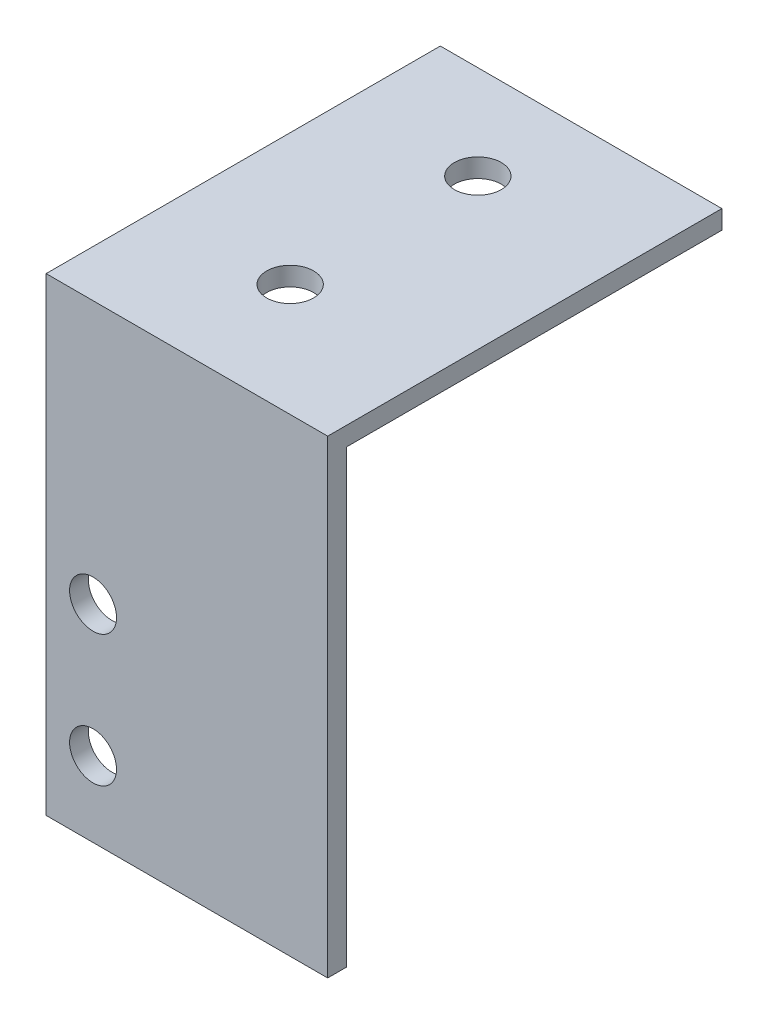
ISO-10303-21;
HEADER;
FILE_DESCRIPTION(('STEP AP214'),'2;1');
FILE_NAME('part.step','',(''),(''),'','','');
FILE_SCHEMA(('AUTOMOTIVE_DESIGN { 1 0 10303 214 1 1 1 1 }'));
ENDSEC;
DATA;
#1=APPLICATION_CONTEXT('core data for automotive mechanical design processes');
#2=APPLICATION_PROTOCOL_DEFINITION('international standard','automotive_design',2000,#1);
#3=PRODUCT_CONTEXT('',#1,'mechanical');
#4=PRODUCT('Part','Part','',(#3));
#5=PRODUCT_RELATED_PRODUCT_CATEGORY('part','',(#4));
#6=PRODUCT_DEFINITION_FORMATION('','',#4);
#7=PRODUCT_DEFINITION_CONTEXT('part definition',#1,'design');
#8=PRODUCT_DEFINITION('design','',#6,#7);
#9=PRODUCT_DEFINITION_SHAPE('','',#8);
#10=(LENGTH_UNIT() NAMED_UNIT(*) SI_UNIT(.MILLI.,.METRE.));
#11=(NAMED_UNIT(*) PLANE_ANGLE_UNIT() SI_UNIT($,.RADIAN.));
#12=(NAMED_UNIT(*) SI_UNIT($,.STERADIAN.) SOLID_ANGLE_UNIT());
#13=UNCERTAINTY_MEASURE_WITH_UNIT(LENGTH_MEASURE(1.E-05),#10,'distance_accuracy_value','');
#14=(GEOMETRIC_REPRESENTATION_CONTEXT(3) GLOBAL_UNCERTAINTY_ASSIGNED_CONTEXT((#13)) GLOBAL_UNIT_ASSIGNED_CONTEXT((#10,
#11,#12)) REPRESENTATION_CONTEXT('',''));
#15=CARTESIAN_POINT('',(0.,0.,0.));
#16=DIRECTION('',(0.,0.,1.));
#17=DIRECTION('',(1.,0.,0.));
#18=AXIS2_PLACEMENT_3D('',#15,#16,#17);
#19=CARTESIAN_POINT('',(0.,0.,1.));
#20=DIRECTION('',(-1.,0.,0.));
#21=DIRECTION('',(0.,0.,1.));
#22=AXIS2_PLACEMENT_3D('',#19,#20,#21);
#23=PLANE('',#22);
#24=DIRECTION('',(0.,1.,0.));
#25=VECTOR('',#24,1.);
#26=CARTESIAN_POINT('',(0.,0.,0.));
#27=LINE('',#26,#25);
#28=CARTESIAN_POINT('',(0.,0.,0.));
#29=VERTEX_POINT('',#28);
#30=CARTESIAN_POINT('',(0.,24.,0.));
#31=VERTEX_POINT('',#30);
#32=EDGE_CURVE('E135',#29,#31,#27,.T.);
#33=ORIENTED_EDGE('',*,*,#32,.F.);
#34=DIRECTION('',(0.,0.,-1.));
#35=VECTOR('',#34,1.);
#36=CARTESIAN_POINT('',(0.,0.,1.));
#37=LINE('',#36,#35);
#38=CARTESIAN_POINT('',(0.,0.,1.));
#39=VERTEX_POINT('',#38);
#40=EDGE_CURVE('E11',#39,#29,#37,.T.);
#41=ORIENTED_EDGE('',*,*,#40,.F.);
#42=DIRECTION('',(0.,1.,0.));
#43=VECTOR('',#42,1.);
#44=CARTESIAN_POINT('',(0.,0.,1.));
#45=LINE('',#44,#43);
#46=CARTESIAN_POINT('',(0.,25.,1.));
#47=VERTEX_POINT('',#46);
#48=EDGE_CURVE('E95',#39,#47,#45,.T.);
#49=ORIENTED_EDGE('',*,*,#48,.T.);
#50=DIRECTION('',(0.,0.,-1.));
#51=VECTOR('',#50,1.);
#52=CARTESIAN_POINT('',(0.,25.,1.));
#53=LINE('',#52,#51);
#54=CARTESIAN_POINT('',(0.,25.,-20.));
#55=VERTEX_POINT('',#54);
#56=EDGE_CURVE('E36',#47,#55,#53,.T.);
#57=ORIENTED_EDGE('',*,*,#56,.T.);
#58=DIRECTION('',(0.,1.,0.));
#59=VECTOR('',#58,1.);
#60=CARTESIAN_POINT('',(0.,25.,-20.));
#61=LINE('',#60,#59);
#62=CARTESIAN_POINT('',(0.,24.,-20.));
#63=VERTEX_POINT('',#62);
#64=EDGE_CURVE('E93',#63,#55,#61,.T.);
#65=ORIENTED_EDGE('',*,*,#64,.F.);
#66=DIRECTION('',(0.,0.,1.));
#67=VECTOR('',#66,1.);
#68=CARTESIAN_POINT('',(0.,24.,-20.));
#69=LINE('',#68,#67);
#70=EDGE_CURVE('E117',#63,#31,#69,.T.);
#71=ORIENTED_EDGE('',*,*,#70,.T.);
#72=EDGE_LOOP('',(#33,#41,#49,#57,#65,#71));
#73=FACE_BOUND('',#72,.T.);
#74=ADVANCED_FACE('F33',(#73),#23,.T.);
#75=CARTESIAN_POINT('',(0.,0.,1.));
#76=DIRECTION('',(0.,1.,0.));
#77=DIRECTION('',(0.,0.,1.));
#78=AXIS2_PLACEMENT_3D('',#75,#76,#77);
#79=PLANE('',#78);
#80=DIRECTION('',(1.,0.,0.));
#81=VECTOR('',#80,1.);
#82=CARTESIAN_POINT('',(0.,0.,0.));
#83=LINE('',#82,#81);
#84=CARTESIAN_POINT('',(15.,0.,0.));
#85=VERTEX_POINT('',#84);
#86=EDGE_CURVE('E138',#29,#85,#83,.T.);
#87=ORIENTED_EDGE('',*,*,#86,.T.);
#88=DIRECTION('',(0.,0.,-1.));
#89=VECTOR('',#88,1.);
#90=CARTESIAN_POINT('',(15.,0.,1.));
#91=LINE('',#90,#89);
#92=CARTESIAN_POINT('',(15.,0.,1.));
#93=VERTEX_POINT('',#92);
#94=EDGE_CURVE('E41',#93,#85,#91,.T.);
#95=ORIENTED_EDGE('',*,*,#94,.F.);
#96=DIRECTION('',(1.,0.,0.));
#97=VECTOR('',#96,1.);
#98=CARTESIAN_POINT('',(0.,0.,1.));
#99=LINE('',#98,#97);
#100=EDGE_CURVE('E97',#39,#93,#99,.T.);
#101=ORIENTED_EDGE('',*,*,#100,.F.);
#102=ORIENTED_EDGE('',*,*,#40,.T.);
#103=EDGE_LOOP('',(#87,#95,#101,#102));
#104=FACE_BOUND('',#103,.T.);
#105=ADVANCED_FACE('F159',(#104),#79,.F.);
#106=CARTESIAN_POINT('',(15.,0.,1.));
#107=DIRECTION('',(-1.,0.,0.));
#108=DIRECTION('',(0.,0.,1.));
#109=AXIS2_PLACEMENT_3D('',#106,#107,#108);
#110=PLANE('',#109);
#111=DIRECTION('',(0.,1.,0.));
#112=VECTOR('',#111,1.);
#113=CARTESIAN_POINT('',(15.,0.,0.));
#114=LINE('',#113,#112);
#115=CARTESIAN_POINT('',(15.,24.,0.));
#116=VERTEX_POINT('',#115);
#117=EDGE_CURVE('E144',#85,#116,#114,.T.);
#118=ORIENTED_EDGE('',*,*,#117,.T.);
#119=DIRECTION('',(0.,0.,1.));
#120=VECTOR('',#119,1.);
#121=CARTESIAN_POINT('',(15.,24.,-20.));
#122=LINE('',#121,#120);
#123=CARTESIAN_POINT('',(15.,24.,-20.));
#124=VERTEX_POINT('',#123);
#125=EDGE_CURVE('E120',#124,#116,#122,.T.);
#126=ORIENTED_EDGE('',*,*,#125,.F.);
#127=DIRECTION('',(0.,-1.,0.));
#128=VECTOR('',#127,1.);
#129=CARTESIAN_POINT('',(15.,25.,-20.));
#130=LINE('',#129,#128);
#131=CARTESIAN_POINT('',(15.,25.,-20.));
#132=VERTEX_POINT('',#131);
#133=EDGE_CURVE('E104',#132,#124,#130,.T.);
#134=ORIENTED_EDGE('',*,*,#133,.F.);
#135=DIRECTION('',(0.,0.,-1.));
#136=VECTOR('',#135,1.);
#137=CARTESIAN_POINT('',(15.,25.,1.));
#138=LINE('',#137,#136);
#139=CARTESIAN_POINT('',(15.,25.,1.));
#140=VERTEX_POINT('',#139);
#141=EDGE_CURVE('E96',#140,#132,#138,.T.);
#142=ORIENTED_EDGE('',*,*,#141,.F.);
#143=DIRECTION('',(0.,1.,0.));
#144=VECTOR('',#143,1.);
#145=CARTESIAN_POINT('',(15.,0.,1.));
#146=LINE('',#145,#144);
#147=EDGE_CURVE('E140',#93,#140,#146,.T.);
#148=ORIENTED_EDGE('',*,*,#147,.F.);
#149=ORIENTED_EDGE('',*,*,#94,.T.);
#150=EDGE_LOOP('',(#118,#126,#134,#142,#148,#149));
#151=FACE_BOUND('',#150,.T.);
#152=ADVANCED_FACE('F151',(#151),#110,.F.);
#153=CARTESIAN_POINT('',(0.,25.,1.));
#154=DIRECTION('',(0.,1.,0.));
#155=DIRECTION('',(0.,0.,1.));
#156=AXIS2_PLACEMENT_3D('',#153,#154,#155);
#157=PLANE('',#156);
#158=CARTESIAN_POINT('',(7.,25.,-5.));
#159=DIRECTION('',(0.,1.,0.));
#160=DIRECTION('',(0.,0.,1.));
#161=AXIS2_PLACEMENT_3D('',#158,#159,#160);
#162=CIRCLE('',#161,1.24999999999999);
#163=CARTESIAN_POINT('',(7.,25.,-3.75000000000001));
#164=VERTEX_POINT('',#163);
#165=EDGE_CURVE('E178',#164,#164,#162,.T.);
#166=ORIENTED_EDGE('',*,*,#165,.F.);
#167=EDGE_LOOP('',(#166));
#168=FACE_BOUND('',#167,.T.);
#169=CARTESIAN_POINT('',(7.,25.,-15.));
#170=DIRECTION('',(0.,1.,0.));
#171=DIRECTION('',(0.,0.,1.));
#172=AXIS2_PLACEMENT_3D('',#169,#170,#171);
#173=CIRCLE('',#172,1.24999999999999);
#174=CARTESIAN_POINT('',(7.,25.,-13.75));
#175=VERTEX_POINT('',#174);
#176=EDGE_CURVE('E111',#175,#175,#173,.T.);
#177=ORIENTED_EDGE('',*,*,#176,.F.);
#178=EDGE_LOOP('',(#177));
#179=FACE_BOUND('',#178,.T.);
#180=ORIENTED_EDGE('',*,*,#141,.T.);
#181=DIRECTION('',(1.,0.,0.));
#182=VECTOR('',#181,1.);
#183=CARTESIAN_POINT('',(0.,25.,-20.));
#184=LINE('',#183,#182);
#185=EDGE_CURVE('E99',#55,#132,#184,.T.);
#186=ORIENTED_EDGE('',*,*,#185,.F.);
#187=ORIENTED_EDGE('',*,*,#56,.F.);
#188=DIRECTION('',(1.,0.,0.));
#189=VECTOR('',#188,1.);
#190=CARTESIAN_POINT('',(0.,25.,1.));
#191=LINE('',#190,#189);
#192=EDGE_CURVE('E137',#47,#140,#191,.T.);
#193=ORIENTED_EDGE('',*,*,#192,.T.);
#194=EDGE_LOOP('',(#180,#186,#187,#193));
#195=FACE_BOUND('',#194,.T.);
#196=ADVANCED_FACE('F100',(#168,#179,#195),#157,.T.);
#197=CARTESIAN_POINT('',(0.,0.,1.));
#198=DIRECTION('',(0.,0.,-1.));
#199=DIRECTION('',(-1.,0.,0.));
#200=AXIS2_PLACEMENT_3D('',#197,#198,#199);
#201=PLANE('',#200);
#202=CARTESIAN_POINT('',(2.5,11.,1.));
#203=DIRECTION('',(0.,0.,-1.));
#204=DIRECTION('',(-1.,0.,0.));
#205=AXIS2_PLACEMENT_3D('',#202,#203,#204);
#206=CIRCLE('',#205,1.24999999999999);
#207=CARTESIAN_POINT('',(1.25000000000001,11.,1.));
#208=VERTEX_POINT('',#207);
#209=EDGE_CURVE('E126',#208,#208,#206,.T.);
#210=ORIENTED_EDGE('',*,*,#209,.T.);
#211=EDGE_LOOP('',(#210));
#212=FACE_BOUND('',#211,.T.);
#213=CARTESIAN_POINT('',(2.5,4.,1.));
#214=DIRECTION('',(0.,0.,-1.));
#215=DIRECTION('',(-1.,0.,0.));
#216=AXIS2_PLACEMENT_3D('',#213,#214,#215);
#217=CIRCLE('',#216,1.24999999999999);
#218=CARTESIAN_POINT('',(1.25000000000001,4.,1.));
#219=VERTEX_POINT('',#218);
#220=EDGE_CURVE('E132',#219,#219,#217,.T.);
#221=ORIENTED_EDGE('',*,*,#220,.T.);
#222=EDGE_LOOP('',(#221));
#223=FACE_BOUND('',#222,.T.);
#224=ORIENTED_EDGE('',*,*,#48,.F.);
#225=ORIENTED_EDGE('',*,*,#100,.T.);
#226=ORIENTED_EDGE('',*,*,#147,.T.);
#227=ORIENTED_EDGE('',*,*,#192,.F.);
#228=EDGE_LOOP('',(#224,#225,#226,#227));
#229=FACE_BOUND('',#228,.T.);
#230=ADVANCED_FACE('F158',(#212,#223,#229),#201,.F.);
#231=CARTESIAN_POINT('',(0.,0.,0.));
#232=DIRECTION('',(0.,0.,-1.));
#233=DIRECTION('',(-1.,0.,0.));
#234=AXIS2_PLACEMENT_3D('',#231,#232,#233);
#235=PLANE('',#234);
#236=DIRECTION('',(-1.,0.,0.));
#237=VECTOR('',#236,1.);
#238=CARTESIAN_POINT('',(0.,24.,0.));
#239=LINE('',#238,#237);
#240=EDGE_CURVE('E49',#116,#31,#239,.T.);
#241=ORIENTED_EDGE('',*,*,#240,.F.);
#242=ORIENTED_EDGE('',*,*,#117,.F.);
#243=ORIENTED_EDGE('',*,*,#86,.F.);
#244=ORIENTED_EDGE('',*,*,#32,.T.);
#245=EDGE_LOOP('',(#241,#242,#243,#244));
#246=FACE_BOUND('',#245,.T.);
#247=CARTESIAN_POINT('',(2.5,11.,0.));
#248=DIRECTION('',(0.,0.,-1.));
#249=DIRECTION('',(-1.,0.,0.));
#250=AXIS2_PLACEMENT_3D('',#247,#248,#249);
#251=CIRCLE('',#250,1.24999999999999);
#252=CARTESIAN_POINT('',(1.25000000000001,11.,0.));
#253=VERTEX_POINT('',#252);
#254=EDGE_CURVE('E123',#253,#253,#251,.T.);
#255=ORIENTED_EDGE('',*,*,#254,.F.);
#256=EDGE_LOOP('',(#255));
#257=FACE_BOUND('',#256,.T.);
#258=CARTESIAN_POINT('',(2.5,4.,0.));
#259=DIRECTION('',(0.,0.,-1.));
#260=DIRECTION('',(-1.,0.,0.));
#261=AXIS2_PLACEMENT_3D('',#258,#259,#260);
#262=CIRCLE('',#261,1.24999999999999);
#263=CARTESIAN_POINT('',(1.25000000000001,4.,0.));
#264=VERTEX_POINT('',#263);
#265=EDGE_CURVE('E129',#264,#264,#262,.T.);
#266=ORIENTED_EDGE('',*,*,#265,.F.);
#267=EDGE_LOOP('',(#266));
#268=FACE_BOUND('',#267,.T.);
#269=ADVANCED_FACE('F153',(#246,#257,#268),#235,.T.);
#270=CARTESIAN_POINT('',(2.5,4.,0.));
#271=DIRECTION('',(0.,0.,-1.));
#272=DIRECTION('',(-1.,0.,0.));
#273=AXIS2_PLACEMENT_3D('',#270,#271,#272);
#274=CYLINDRICAL_SURFACE('',#273,1.24999999999999);
#275=ORIENTED_EDGE('',*,*,#265,.T.);
#276=EDGE_LOOP('',(#275));
#277=FACE_BOUND('',#276,.T.);
#278=ORIENTED_EDGE('',*,*,#220,.F.);
#279=EDGE_LOOP('',(#278));
#280=FACE_BOUND('',#279,.T.);
#281=ADVANCED_FACE('F204',(#277,#280),#274,.F.);
#282=CARTESIAN_POINT('',(2.5,11.,0.));
#283=DIRECTION('',(0.,0.,-1.));
#284=DIRECTION('',(-1.,0.,0.));
#285=AXIS2_PLACEMENT_3D('',#282,#283,#284);
#286=CYLINDRICAL_SURFACE('',#285,1.24999999999999);
#287=ORIENTED_EDGE('',*,*,#254,.T.);
#288=EDGE_LOOP('',(#287));
#289=FACE_BOUND('',#288,.T.);
#290=ORIENTED_EDGE('',*,*,#209,.F.);
#291=EDGE_LOOP('',(#290));
#292=FACE_BOUND('',#291,.T.);
#293=ADVANCED_FACE('F196',(#289,#292),#286,.F.);
#294=CARTESIAN_POINT('',(0.,24.,-20.));
#295=DIRECTION('',(0.,1.,0.));
#296=DIRECTION('',(-1.,0.,0.));
#297=AXIS2_PLACEMENT_3D('',#294,#295,#296);
#298=PLANE('',#297);
#299=CARTESIAN_POINT('',(7.,24.,-5.));
#300=DIRECTION('',(0.,-1.,0.));
#301=DIRECTION('',(0.,0.,-1.));
#302=AXIS2_PLACEMENT_3D('',#299,#300,#301);
#303=CIRCLE('',#302,1.24999999999999);
#304=CARTESIAN_POINT('',(7.,24.,-6.24999999999999));
#305=VERTEX_POINT('',#304);
#306=EDGE_CURVE('E186',#305,#305,#303,.T.);
#307=ORIENTED_EDGE('',*,*,#306,.F.);
#308=EDGE_LOOP('',(#307));
#309=FACE_BOUND('',#308,.T.);
#310=CARTESIAN_POINT('',(7.,24.,-15.));
#311=DIRECTION('',(0.,-1.,0.));
#312=DIRECTION('',(0.,0.,-1.));
#313=AXIS2_PLACEMENT_3D('',#310,#311,#312);
#314=CIRCLE('',#313,1.24999999999999);
#315=CARTESIAN_POINT('',(7.,24.,-16.25));
#316=VERTEX_POINT('',#315);
#317=EDGE_CURVE('E182',#316,#316,#314,.T.);
#318=ORIENTED_EDGE('',*,*,#317,.F.);
#319=EDGE_LOOP('',(#318));
#320=FACE_BOUND('',#319,.T.);
#321=ORIENTED_EDGE('',*,*,#240,.T.);
#322=ORIENTED_EDGE('',*,*,#70,.F.);
#323=DIRECTION('',(-1.,0.,0.));
#324=VECTOR('',#323,1.);
#325=CARTESIAN_POINT('',(0.,24.,-20.));
#326=LINE('',#325,#324);
#327=EDGE_CURVE('E108',#124,#63,#326,.T.);
#328=ORIENTED_EDGE('',*,*,#327,.F.);
#329=ORIENTED_EDGE('',*,*,#125,.T.);
#330=EDGE_LOOP('',(#321,#322,#328,#329));
#331=FACE_BOUND('',#330,.T.);
#332=ADVANCED_FACE('F156',(#309,#320,#331),#298,.F.);
#333=CARTESIAN_POINT('',(0.,0.,-20.));
#334=DIRECTION('',(0.,0.,1.));
#335=DIRECTION('',(1.,0.,0.));
#336=AXIS2_PLACEMENT_3D('',#333,#334,#335);
#337=PLANE('',#336);
#338=ORIENTED_EDGE('',*,*,#64,.T.);
#339=ORIENTED_EDGE('',*,*,#185,.T.);
#340=ORIENTED_EDGE('',*,*,#133,.T.);
#341=ORIENTED_EDGE('',*,*,#327,.T.);
#342=EDGE_LOOP('',(#338,#339,#340,#341));
#343=FACE_BOUND('',#342,.T.);
#344=ADVANCED_FACE('F106',(#343),#337,.F.);
#345=CARTESIAN_POINT('',(7.,24.,-15.));
#346=DIRECTION('',(0.,-1.,0.));
#347=DIRECTION('',(0.,0.,-1.));
#348=AXIS2_PLACEMENT_3D('',#345,#346,#347);
#349=CYLINDRICAL_SURFACE('',#348,1.24999999999999);
#350=ORIENTED_EDGE('',*,*,#176,.T.);
#351=EDGE_LOOP('',(#350));
#352=FACE_BOUND('',#351,.T.);
#353=ORIENTED_EDGE('',*,*,#317,.T.);
#354=EDGE_LOOP('',(#353));
#355=FACE_BOUND('',#354,.T.);
#356=ADVANCED_FACE('F202',(#352,#355),#349,.F.);
#357=CARTESIAN_POINT('',(7.,24.,-5.));
#358=DIRECTION('',(0.,-1.,0.));
#359=DIRECTION('',(0.,0.,-1.));
#360=AXIS2_PLACEMENT_3D('',#357,#358,#359);
#361=CYLINDRICAL_SURFACE('',#360,1.24999999999999);
#362=ORIENTED_EDGE('',*,*,#165,.T.);
#363=EDGE_LOOP('',(#362));
#364=FACE_BOUND('',#363,.T.);
#365=ORIENTED_EDGE('',*,*,#306,.T.);
#366=EDGE_LOOP('',(#365));
#367=FACE_BOUND('',#366,.T.);
#368=ADVANCED_FACE('F192',(#364,#367),#361,.F.);
#369=CLOSED_SHELL('',(#74,#105,#152,#196,#230,#269,#281,#293,#332,#344,#356,#368));
#370=MANIFOLD_SOLID_BREP('B2',#369);
#371=ADVANCED_BREP_SHAPE_REPRESENTATION('',(#18,#370),#14);
#372=SHAPE_DEFINITION_REPRESENTATION(#9,#371);
ENDSEC;
END-ISO-10303-21;
